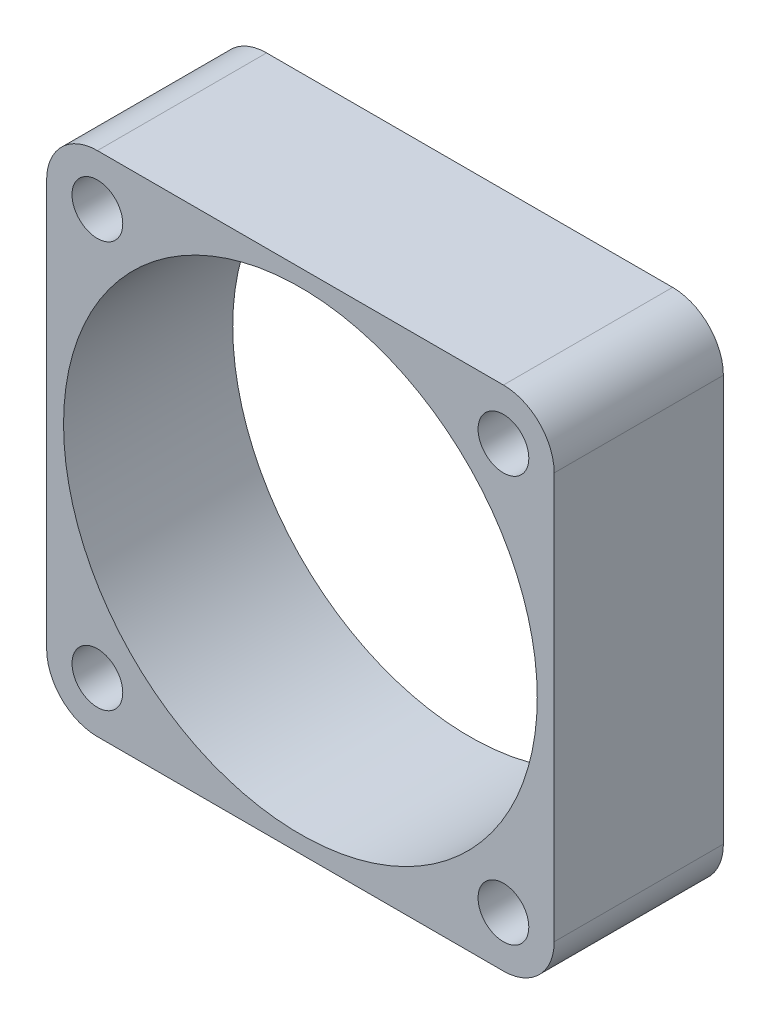
ISO-10303-21;
HEADER;
FILE_DESCRIPTION(('STEP AP214'),'2;1');
FILE_NAME('part.step','',(''),(''),'','','');
FILE_SCHEMA(('AUTOMOTIVE_DESIGN { 1 0 10303 214 1 1 1 1 }'));
ENDSEC;
DATA;
#1=APPLICATION_CONTEXT('core data for automotive mechanical design processes');
#2=APPLICATION_PROTOCOL_DEFINITION('international standard','automotive_design',2000,#1);
#3=PRODUCT_CONTEXT('',#1,'mechanical');
#4=PRODUCT('Part','Part','',(#3));
#5=PRODUCT_RELATED_PRODUCT_CATEGORY('part','',(#4));
#6=PRODUCT_DEFINITION_FORMATION('','',#4);
#7=PRODUCT_DEFINITION_CONTEXT('part definition',#1,'design');
#8=PRODUCT_DEFINITION('design','',#6,#7);
#9=PRODUCT_DEFINITION_SHAPE('','',#8);
#10=(LENGTH_UNIT() NAMED_UNIT(*) SI_UNIT(.MILLI.,.METRE.));
#11=(NAMED_UNIT(*) PLANE_ANGLE_UNIT() SI_UNIT($,.RADIAN.));
#12=(NAMED_UNIT(*) SI_UNIT($,.STERADIAN.) SOLID_ANGLE_UNIT());
#13=UNCERTAINTY_MEASURE_WITH_UNIT(LENGTH_MEASURE(1.E-05),#10,'distance_accuracy_value','');
#14=(GEOMETRIC_REPRESENTATION_CONTEXT(3) GLOBAL_UNCERTAINTY_ASSIGNED_CONTEXT((#13)) GLOBAL_UNIT_ASSIGNED_CONTEXT((#10,
#11,#12)) REPRESENTATION_CONTEXT('',''));
#15=CARTESIAN_POINT('',(0.,0.,0.));
#16=DIRECTION('',(0.,0.,1.));
#17=DIRECTION('',(1.,0.,0.));
#18=AXIS2_PLACEMENT_3D('',#15,#16,#17);
#19=CARTESIAN_POINT('',(0.,0.,10.));
#20=DIRECTION('',(0.,0.,-1.));
#21=DIRECTION('',(-1.,0.,0.));
#22=AXIS2_PLACEMENT_3D('',#19,#20,#21);
#23=PLANE('',#22);
#24=DIRECTION('',(0.,-1.,0.));
#25=VECTOR('',#24,1.);
#26=CARTESIAN_POINT('',(-15.,15.,10.));
#27=LINE('',#26,#25);
#28=CARTESIAN_POINT('',(-15.,12.,10.));
#29=VERTEX_POINT('',#28);
#30=CARTESIAN_POINT('',(-15.,-12.,10.));
#31=VERTEX_POINT('',#30);
#32=EDGE_CURVE('E143',#29,#31,#27,.T.);
#33=ORIENTED_EDGE('',*,*,#32,.T.);
#34=CARTESIAN_POINT('',(-12.,-12.,10.));
#35=DIRECTION('',(0.,0.,-1.));
#36=DIRECTION('',(-1.,0.,0.));
#37=AXIS2_PLACEMENT_3D('',#34,#35,#36);
#38=CIRCLE('',#37,3.);
#39=CARTESIAN_POINT('',(-12.,-15.,10.));
#40=VERTEX_POINT('',#39);
#41=EDGE_CURVE('E157',#31,#40,#38,.F.);
#42=ORIENTED_EDGE('',*,*,#41,.T.);
#43=DIRECTION('',(1.,0.,0.));
#44=VECTOR('',#43,1.);
#45=CARTESIAN_POINT('',(15.,-15.,10.));
#46=LINE('',#45,#44);
#47=CARTESIAN_POINT('',(12.,-15.,10.));
#48=VERTEX_POINT('',#47);
#49=EDGE_CURVE('E124',#40,#48,#46,.T.);
#50=ORIENTED_EDGE('',*,*,#49,.T.);
#51=CARTESIAN_POINT('',(12.,-12.,10.));
#52=DIRECTION('',(0.,0.,-1.));
#53=DIRECTION('',(-1.,0.,0.));
#54=AXIS2_PLACEMENT_3D('',#51,#52,#53);
#55=CIRCLE('',#54,3.);
#56=CARTESIAN_POINT('',(15.,-12.,10.));
#57=VERTEX_POINT('',#56);
#58=EDGE_CURVE('E153',#48,#57,#55,.F.);
#59=ORIENTED_EDGE('',*,*,#58,.T.);
#60=DIRECTION('',(0.,1.,0.));
#61=VECTOR('',#60,1.);
#62=CARTESIAN_POINT('',(15.,15.,10.));
#63=LINE('',#62,#61);
#64=CARTESIAN_POINT('',(15.,12.,10.));
#65=VERTEX_POINT('',#64);
#66=EDGE_CURVE('E166',#57,#65,#63,.T.);
#67=ORIENTED_EDGE('',*,*,#66,.T.);
#68=CARTESIAN_POINT('',(12.,12.,10.));
#69=DIRECTION('',(0.,0.,-1.));
#70=DIRECTION('',(-1.,0.,0.));
#71=AXIS2_PLACEMENT_3D('',#68,#69,#70);
#72=CIRCLE('',#71,3.);
#73=CARTESIAN_POINT('',(12.,15.,10.));
#74=VERTEX_POINT('',#73);
#75=EDGE_CURVE('E59',#65,#74,#72,.F.);
#76=ORIENTED_EDGE('',*,*,#75,.T.);
#77=DIRECTION('',(-1.,0.,0.));
#78=VECTOR('',#77,1.);
#79=CARTESIAN_POINT('',(15.,15.,10.));
#80=LINE('',#79,#78);
#81=CARTESIAN_POINT('',(-12.,15.,10.));
#82=VERTEX_POINT('',#81);
#83=EDGE_CURVE('E144',#74,#82,#80,.T.);
#84=ORIENTED_EDGE('',*,*,#83,.T.);
#85=CARTESIAN_POINT('',(-12.,12.,10.));
#86=DIRECTION('',(0.,0.,-1.));
#87=DIRECTION('',(-1.,0.,0.));
#88=AXIS2_PLACEMENT_3D('',#85,#86,#87);
#89=CIRCLE('',#88,3.);
#90=EDGE_CURVE('E155',#82,#29,#89,.F.);
#91=ORIENTED_EDGE('',*,*,#90,.T.);
#92=EDGE_LOOP('',(#33,#42,#50,#59,#67,#76,#84,#91));
#93=FACE_BOUND('',#92,.T.);
#94=CARTESIAN_POINT('',(0.,0.,10.));
#95=DIRECTION('',(0.,0.,1.));
#96=DIRECTION('',(1.,0.,0.));
#97=AXIS2_PLACEMENT_3D('',#94,#95,#96);
#98=CIRCLE('',#97,14.);
#99=CARTESIAN_POINT('',(14.,0.,10.));
#100=VERTEX_POINT('',#99);
#101=EDGE_CURVE('E138',#100,#100,#98,.T.);
#102=ORIENTED_EDGE('',*,*,#101,.F.);
#103=EDGE_LOOP('',(#102));
#104=FACE_BOUND('',#103,.T.);
#105=CARTESIAN_POINT('',(-12.,12.,10.));
#106=DIRECTION('',(0.,0.,1.));
#107=DIRECTION('',(1.,0.,0.));
#108=AXIS2_PLACEMENT_3D('',#105,#106,#107);
#109=CIRCLE('',#108,1.5);
#110=CARTESIAN_POINT('',(-10.5,12.,10.));
#111=VERTEX_POINT('',#110);
#112=EDGE_CURVE('E189',#111,#111,#109,.T.);
#113=ORIENTED_EDGE('',*,*,#112,.F.);
#114=EDGE_LOOP('',(#113));
#115=FACE_BOUND('',#114,.T.);
#116=CARTESIAN_POINT('',(12.,12.0000000000007,10.));
#117=DIRECTION('',(0.,0.,1.));
#118=DIRECTION('',(1.,0.,0.));
#119=AXIS2_PLACEMENT_3D('',#116,#117,#118);
#120=CIRCLE('',#119,1.5000000000007);
#121=CARTESIAN_POINT('',(13.5000000000007,12.0000000000007,10.));
#122=VERTEX_POINT('',#121);
#123=EDGE_CURVE('E195',#122,#122,#120,.T.);
#124=ORIENTED_EDGE('',*,*,#123,.F.);
#125=EDGE_LOOP('',(#124));
#126=FACE_BOUND('',#125,.T.);
#127=CARTESIAN_POINT('',(12.0000000000007,-11.9999999999993,10.));
#128=DIRECTION('',(0.,0.,1.));
#129=DIRECTION('',(1.,0.,0.));
#130=AXIS2_PLACEMENT_3D('',#127,#128,#129);
#131=CIRCLE('',#130,1.50000000000095);
#132=CARTESIAN_POINT('',(13.5000000000016,-11.9999999999993,10.));
#133=VERTEX_POINT('',#132);
#134=EDGE_CURVE('E201',#133,#133,#131,.T.);
#135=ORIENTED_EDGE('',*,*,#134,.F.);
#136=EDGE_LOOP('',(#135));
#137=FACE_BOUND('',#136,.T.);
#138=CARTESIAN_POINT('',(-11.9999999999993,-12.,10.));
#139=DIRECTION('',(0.,0.,1.));
#140=DIRECTION('',(1.,0.,0.));
#141=AXIS2_PLACEMENT_3D('',#138,#139,#140);
#142=CIRCLE('',#141,1.50000000000036);
#143=CARTESIAN_POINT('',(-10.499999999999,-12.,10.));
#144=VERTEX_POINT('',#143);
#145=EDGE_CURVE('E207',#144,#144,#142,.T.);
#146=ORIENTED_EDGE('',*,*,#145,.F.);
#147=EDGE_LOOP('',(#146));
#148=FACE_BOUND('',#147,.T.);
#149=ADVANCED_FACE('F37',(#93,#104,#115,#126,#137,#148),#23,.F.);
#150=CARTESIAN_POINT('',(0.,0.,0.));
#151=DIRECTION('',(0.,0.,-1.));
#152=DIRECTION('',(-1.,0.,0.));
#153=AXIS2_PLACEMENT_3D('',#150,#151,#152);
#154=PLANE('',#153);
#155=CARTESIAN_POINT('',(12.0000000000007,-11.9999999999993,0.));
#156=DIRECTION('',(0.,0.,1.));
#157=DIRECTION('',(1.,0.,0.));
#158=AXIS2_PLACEMENT_3D('',#155,#156,#157);
#159=CIRCLE('',#158,1.50000000000095);
#160=CARTESIAN_POINT('',(13.5000000000016,-11.9999999999993,0.));
#161=VERTEX_POINT('',#160);
#162=EDGE_CURVE('E204',#161,#161,#159,.T.);
#163=ORIENTED_EDGE('',*,*,#162,.T.);
#164=EDGE_LOOP('',(#163));
#165=FACE_BOUND('',#164,.T.);
#166=CARTESIAN_POINT('',(-12.,12.,0.));
#167=DIRECTION('',(0.,0.,1.));
#168=DIRECTION('',(1.,0.,0.));
#169=AXIS2_PLACEMENT_3D('',#166,#167,#168);
#170=CIRCLE('',#169,1.5);
#171=CARTESIAN_POINT('',(-10.5,12.,0.));
#172=VERTEX_POINT('',#171);
#173=EDGE_CURVE('E192',#172,#172,#170,.T.);
#174=ORIENTED_EDGE('',*,*,#173,.T.);
#175=EDGE_LOOP('',(#174));
#176=FACE_BOUND('',#175,.T.);
#177=DIRECTION('',(1.,0.,0.));
#178=VECTOR('',#177,1.);
#179=CARTESIAN_POINT('',(15.,-15.,0.));
#180=LINE('',#179,#178);
#181=CARTESIAN_POINT('',(-12.,-15.,0.));
#182=VERTEX_POINT('',#181);
#183=CARTESIAN_POINT('',(12.,-15.,0.));
#184=VERTEX_POINT('',#183);
#185=EDGE_CURVE('E121',#182,#184,#180,.T.);
#186=ORIENTED_EDGE('',*,*,#185,.F.);
#187=CARTESIAN_POINT('',(-12.,-12.,0.));
#188=DIRECTION('',(0.,0.,-1.));
#189=DIRECTION('',(-1.,0.,0.));
#190=AXIS2_PLACEMENT_3D('',#187,#188,#189);
#191=CIRCLE('',#190,3.);
#192=CARTESIAN_POINT('',(-15.,-12.,0.));
#193=VERTEX_POINT('',#192);
#194=EDGE_CURVE('E104',#182,#193,#191,.T.);
#195=ORIENTED_EDGE('',*,*,#194,.T.);
#196=DIRECTION('',(0.,-1.,0.));
#197=VECTOR('',#196,1.);
#198=CARTESIAN_POINT('',(-15.,15.,0.));
#199=LINE('',#198,#197);
#200=CARTESIAN_POINT('',(-15.,12.,0.));
#201=VERTEX_POINT('',#200);
#202=EDGE_CURVE('E133',#201,#193,#199,.T.);
#203=ORIENTED_EDGE('',*,*,#202,.F.);
#204=CARTESIAN_POINT('',(-12.,12.,0.));
#205=DIRECTION('',(0.,0.,-1.));
#206=DIRECTION('',(-1.,0.,0.));
#207=AXIS2_PLACEMENT_3D('',#204,#205,#206);
#208=CIRCLE('',#207,3.);
#209=CARTESIAN_POINT('',(-12.,15.,0.));
#210=VERTEX_POINT('',#209);
#211=EDGE_CURVE('E115',#201,#210,#208,.T.);
#212=ORIENTED_EDGE('',*,*,#211,.T.);
#213=DIRECTION('',(-1.,0.,0.));
#214=VECTOR('',#213,1.);
#215=CARTESIAN_POINT('',(15.,15.,0.));
#216=LINE('',#215,#214);
#217=CARTESIAN_POINT('',(12.,15.,0.));
#218=VERTEX_POINT('',#217);
#219=EDGE_CURVE('E136',#218,#210,#216,.T.);
#220=ORIENTED_EDGE('',*,*,#219,.F.);
#221=CARTESIAN_POINT('',(12.,12.,0.));
#222=DIRECTION('',(0.,0.,-1.));
#223=DIRECTION('',(-1.,0.,0.));
#224=AXIS2_PLACEMENT_3D('',#221,#222,#223);
#225=CIRCLE('',#224,3.);
#226=CARTESIAN_POINT('',(15.,12.,0.));
#227=VERTEX_POINT('',#226);
#228=EDGE_CURVE('E125',#218,#227,#225,.T.);
#229=ORIENTED_EDGE('',*,*,#228,.T.);
#230=DIRECTION('',(0.,1.,0.));
#231=VECTOR('',#230,1.);
#232=CARTESIAN_POINT('',(15.,15.,0.));
#233=LINE('',#232,#231);
#234=CARTESIAN_POINT('',(15.,-12.,0.));
#235=VERTEX_POINT('',#234);
#236=EDGE_CURVE('E132',#235,#227,#233,.T.);
#237=ORIENTED_EDGE('',*,*,#236,.F.);
#238=CARTESIAN_POINT('',(12.,-12.,0.));
#239=DIRECTION('',(0.,0.,-1.));
#240=DIRECTION('',(-1.,0.,0.));
#241=AXIS2_PLACEMENT_3D('',#238,#239,#240);
#242=CIRCLE('',#241,3.);
#243=EDGE_CURVE('E131',#235,#184,#242,.T.);
#244=ORIENTED_EDGE('',*,*,#243,.T.);
#245=EDGE_LOOP('',(#186,#195,#203,#212,#220,#229,#237,#244));
#246=FACE_BOUND('',#245,.T.);
#247=CARTESIAN_POINT('',(0.,0.,0.));
#248=DIRECTION('',(0.,0.,1.));
#249=DIRECTION('',(1.,0.,0.));
#250=AXIS2_PLACEMENT_3D('',#247,#248,#249);
#251=CIRCLE('',#250,14.);
#252=CARTESIAN_POINT('',(14.,0.,0.));
#253=VERTEX_POINT('',#252);
#254=EDGE_CURVE('E186',#253,#253,#251,.T.);
#255=ORIENTED_EDGE('',*,*,#254,.T.);
#256=EDGE_LOOP('',(#255));
#257=FACE_BOUND('',#256,.T.);
#258=CARTESIAN_POINT('',(12.,12.0000000000007,0.));
#259=DIRECTION('',(0.,0.,1.));
#260=DIRECTION('',(1.,0.,0.));
#261=AXIS2_PLACEMENT_3D('',#258,#259,#260);
#262=CIRCLE('',#261,1.5000000000007);
#263=CARTESIAN_POINT('',(13.5000000000007,12.0000000000007,0.));
#264=VERTEX_POINT('',#263);
#265=EDGE_CURVE('E198',#264,#264,#262,.T.);
#266=ORIENTED_EDGE('',*,*,#265,.T.);
#267=EDGE_LOOP('',(#266));
#268=FACE_BOUND('',#267,.T.);
#269=CARTESIAN_POINT('',(-11.9999999999993,-12.,0.));
#270=DIRECTION('',(0.,0.,1.));
#271=DIRECTION('',(1.,0.,0.));
#272=AXIS2_PLACEMENT_3D('',#269,#270,#271);
#273=CIRCLE('',#272,1.50000000000036);
#274=CARTESIAN_POINT('',(-10.499999999999,-12.,0.));
#275=VERTEX_POINT('',#274);
#276=EDGE_CURVE('E210',#275,#275,#273,.T.);
#277=ORIENTED_EDGE('',*,*,#276,.T.);
#278=EDGE_LOOP('',(#277));
#279=FACE_BOUND('',#278,.T.);
#280=ADVANCED_FACE('F128',(#165,#176,#246,#257,#268,#279),#154,.T.);
#281=CARTESIAN_POINT('',(-15.,15.,10.));
#282=DIRECTION('',(1.,0.,0.));
#283=DIRECTION('',(0.,1.,0.));
#284=AXIS2_PLACEMENT_3D('',#281,#282,#283);
#285=PLANE('',#284);
#286=ORIENTED_EDGE('',*,*,#202,.T.);
#287=DIRECTION('',(0.,0.,-1.));
#288=VECTOR('',#287,1.);
#289=CARTESIAN_POINT('',(-15.,-12.,10.));
#290=LINE('',#289,#288);
#291=EDGE_CURVE('E109',#193,#31,#290,.F.);
#292=ORIENTED_EDGE('',*,*,#291,.T.);
#293=ORIENTED_EDGE('',*,*,#32,.F.);
#294=DIRECTION('',(0.,0.,-1.));
#295=VECTOR('',#294,1.);
#296=CARTESIAN_POINT('',(-15.,12.,10.));
#297=LINE('',#296,#295);
#298=EDGE_CURVE('E114',#29,#201,#297,.T.);
#299=ORIENTED_EDGE('',*,*,#298,.T.);
#300=EDGE_LOOP('',(#286,#292,#293,#299));
#301=FACE_BOUND('',#300,.T.);
#302=ADVANCED_FACE('F182',(#301),#285,.F.);
#303=CARTESIAN_POINT('',(15.,-15.,10.));
#304=DIRECTION('',(0.,1.,0.));
#305=DIRECTION('',(-1.,0.,0.));
#306=AXIS2_PLACEMENT_3D('',#303,#304,#305);
#307=PLANE('',#306);
#308=ORIENTED_EDGE('',*,*,#49,.F.);
#309=DIRECTION('',(0.,0.,-1.));
#310=VECTOR('',#309,1.);
#311=CARTESIAN_POINT('',(-12.,-15.,10.));
#312=LINE('',#311,#310);
#313=EDGE_CURVE('E108',#40,#182,#312,.T.);
#314=ORIENTED_EDGE('',*,*,#313,.T.);
#315=ORIENTED_EDGE('',*,*,#185,.T.);
#316=DIRECTION('',(0.,0.,-1.));
#317=VECTOR('',#316,1.);
#318=CARTESIAN_POINT('',(12.,-15.,10.));
#319=LINE('',#318,#317);
#320=EDGE_CURVE('E126',#184,#48,#319,.F.);
#321=ORIENTED_EDGE('',*,*,#320,.T.);
#322=EDGE_LOOP('',(#308,#314,#315,#321));
#323=FACE_BOUND('',#322,.T.);
#324=ADVANCED_FACE('F120',(#323),#307,.F.);
#325=CARTESIAN_POINT('',(15.,15.,10.));
#326=DIRECTION('',(-1.,0.,0.));
#327=DIRECTION('',(0.,-1.,0.));
#328=AXIS2_PLACEMENT_3D('',#325,#326,#327);
#329=PLANE('',#328);
#330=ORIENTED_EDGE('',*,*,#66,.F.);
#331=DIRECTION('',(0.,0.,-1.));
#332=VECTOR('',#331,1.);
#333=CARTESIAN_POINT('',(15.,-12.,10.));
#334=LINE('',#333,#332);
#335=EDGE_CURVE('E11',#57,#235,#334,.T.);
#336=ORIENTED_EDGE('',*,*,#335,.T.);
#337=ORIENTED_EDGE('',*,*,#236,.T.);
#338=DIRECTION('',(0.,0.,-1.));
#339=VECTOR('',#338,1.);
#340=CARTESIAN_POINT('',(15.,12.,10.));
#341=LINE('',#340,#339);
#342=EDGE_CURVE('E45',#227,#65,#341,.F.);
#343=ORIENTED_EDGE('',*,*,#342,.T.);
#344=EDGE_LOOP('',(#330,#336,#337,#343));
#345=FACE_BOUND('',#344,.T.);
#346=ADVANCED_FACE('F165',(#345),#329,.F.);
#347=CARTESIAN_POINT('',(15.,15.,10.));
#348=DIRECTION('',(0.,-1.,0.));
#349=DIRECTION('',(1.,0.,0.));
#350=AXIS2_PLACEMENT_3D('',#347,#348,#349);
#351=PLANE('',#350);
#352=ORIENTED_EDGE('',*,*,#219,.T.);
#353=DIRECTION('',(0.,0.,-1.));
#354=VECTOR('',#353,1.);
#355=CARTESIAN_POINT('',(-12.,15.,10.));
#356=LINE('',#355,#354);
#357=EDGE_CURVE('E52',#210,#82,#356,.F.);
#358=ORIENTED_EDGE('',*,*,#357,.T.);
#359=ORIENTED_EDGE('',*,*,#83,.F.);
#360=DIRECTION('',(0.,0.,-1.));
#361=VECTOR('',#360,1.);
#362=CARTESIAN_POINT('',(12.,15.,10.));
#363=LINE('',#362,#361);
#364=EDGE_CURVE('E159',#74,#218,#363,.T.);
#365=ORIENTED_EDGE('',*,*,#364,.T.);
#366=EDGE_LOOP('',(#352,#358,#359,#365));
#367=FACE_BOUND('',#366,.T.);
#368=ADVANCED_FACE('F175',(#367),#351,.F.);
#369=CARTESIAN_POINT('',(0.,0.,10.));
#370=DIRECTION('',(0.,0.,-1.));
#371=DIRECTION('',(-1.,0.,0.));
#372=AXIS2_PLACEMENT_3D('',#369,#370,#371);
#373=CYLINDRICAL_SURFACE('',#372,14.);
#374=ORIENTED_EDGE('',*,*,#101,.T.);
#375=EDGE_LOOP('',(#374));
#376=FACE_BOUND('',#375,.T.);
#377=ORIENTED_EDGE('',*,*,#254,.F.);
#378=EDGE_LOOP('',(#377));
#379=FACE_BOUND('',#378,.T.);
#380=ADVANCED_FACE('F227',(#376,#379),#373,.F.);
#381=CARTESIAN_POINT('',(-12.,12.,10.));
#382=DIRECTION('',(0.,0.,-1.));
#383=DIRECTION('',(-1.,0.,0.));
#384=AXIS2_PLACEMENT_3D('',#381,#382,#383);
#385=CYLINDRICAL_SURFACE('',#384,1.5);
#386=ORIENTED_EDGE('',*,*,#112,.T.);
#387=EDGE_LOOP('',(#386));
#388=FACE_BOUND('',#387,.T.);
#389=ORIENTED_EDGE('',*,*,#173,.F.);
#390=EDGE_LOOP('',(#389));
#391=FACE_BOUND('',#390,.T.);
#392=ADVANCED_FACE('F329',(#388,#391),#385,.F.);
#393=CARTESIAN_POINT('',(12.,12.0000000000007,10.));
#394=DIRECTION('',(0.,0.,-1.));
#395=DIRECTION('',(-1.,0.,0.));
#396=AXIS2_PLACEMENT_3D('',#393,#394,#395);
#397=CYLINDRICAL_SURFACE('',#396,1.5000000000007);
#398=ORIENTED_EDGE('',*,*,#123,.T.);
#399=EDGE_LOOP('',(#398));
#400=FACE_BOUND('',#399,.T.);
#401=ORIENTED_EDGE('',*,*,#265,.F.);
#402=EDGE_LOOP('',(#401));
#403=FACE_BOUND('',#402,.T.);
#404=ADVANCED_FACE('F319',(#400,#403),#397,.F.);
#405=CARTESIAN_POINT('',(12.0000000000007,-11.9999999999993,10.));
#406=DIRECTION('',(0.,0.,-1.));
#407=DIRECTION('',(-1.,0.,0.));
#408=AXIS2_PLACEMENT_3D('',#405,#406,#407);
#409=CYLINDRICAL_SURFACE('',#408,1.50000000000095);
#410=ORIENTED_EDGE('',*,*,#134,.T.);
#411=EDGE_LOOP('',(#410));
#412=FACE_BOUND('',#411,.T.);
#413=ORIENTED_EDGE('',*,*,#162,.F.);
#414=EDGE_LOOP('',(#413));
#415=FACE_BOUND('',#414,.T.);
#416=ADVANCED_FACE('F310',(#412,#415),#409,.F.);
#417=CARTESIAN_POINT('',(-11.9999999999993,-12.,10.));
#418=DIRECTION('',(0.,0.,-1.));
#419=DIRECTION('',(-1.,0.,0.));
#420=AXIS2_PLACEMENT_3D('',#417,#418,#419);
#421=CYLINDRICAL_SURFACE('',#420,1.50000000000036);
#422=ORIENTED_EDGE('',*,*,#145,.T.);
#423=EDGE_LOOP('',(#422));
#424=FACE_BOUND('',#423,.T.);
#425=ORIENTED_EDGE('',*,*,#276,.F.);
#426=EDGE_LOOP('',(#425));
#427=FACE_BOUND('',#426,.T.);
#428=ADVANCED_FACE('F216',(#424,#427),#421,.F.);
#429=CARTESIAN_POINT('',(-12.,-12.,10.));
#430=DIRECTION('',(0.,0.,-1.));
#431=DIRECTION('',(-1.,0.,0.));
#432=AXIS2_PLACEMENT_3D('',#429,#430,#431);
#433=CYLINDRICAL_SURFACE('',#432,3.);
#434=ORIENTED_EDGE('',*,*,#41,.F.);
#435=ORIENTED_EDGE('',*,*,#291,.F.);
#436=ORIENTED_EDGE('',*,*,#194,.F.);
#437=ORIENTED_EDGE('',*,*,#313,.F.);
#438=EDGE_LOOP('',(#434,#435,#436,#437));
#439=FACE_BOUND('',#438,.T.);
#440=ADVANCED_FACE('F107',(#439),#433,.T.);
#441=CARTESIAN_POINT('',(-12.,12.,10.));
#442=DIRECTION('',(0.,0.,-1.));
#443=DIRECTION('',(-1.,0.,0.));
#444=AXIS2_PLACEMENT_3D('',#441,#442,#443);
#445=CYLINDRICAL_SURFACE('',#444,3.);
#446=ORIENTED_EDGE('',*,*,#90,.F.);
#447=ORIENTED_EDGE('',*,*,#357,.F.);
#448=ORIENTED_EDGE('',*,*,#211,.F.);
#449=ORIENTED_EDGE('',*,*,#298,.F.);
#450=EDGE_LOOP('',(#446,#447,#448,#449));
#451=FACE_BOUND('',#450,.T.);
#452=ADVANCED_FACE('F179',(#451),#445,.T.);
#453=CARTESIAN_POINT('',(12.,-12.,10.));
#454=DIRECTION('',(0.,0.,-1.));
#455=DIRECTION('',(-1.,0.,0.));
#456=AXIS2_PLACEMENT_3D('',#453,#454,#455);
#457=CYLINDRICAL_SURFACE('',#456,3.);
#458=ORIENTED_EDGE('',*,*,#58,.F.);
#459=ORIENTED_EDGE('',*,*,#320,.F.);
#460=ORIENTED_EDGE('',*,*,#243,.F.);
#461=ORIENTED_EDGE('',*,*,#335,.F.);
#462=EDGE_LOOP('',(#458,#459,#460,#461));
#463=FACE_BOUND('',#462,.T.);
#464=ADVANCED_FACE('F241',(#463),#457,.T.);
#465=CARTESIAN_POINT('',(12.,12.,10.));
#466=DIRECTION('',(0.,0.,-1.));
#467=DIRECTION('',(-1.,0.,0.));
#468=AXIS2_PLACEMENT_3D('',#465,#466,#467);
#469=CYLINDRICAL_SURFACE('',#468,3.);
#470=ORIENTED_EDGE('',*,*,#75,.F.);
#471=ORIENTED_EDGE('',*,*,#342,.F.);
#472=ORIENTED_EDGE('',*,*,#228,.F.);
#473=ORIENTED_EDGE('',*,*,#364,.F.);
#474=EDGE_LOOP('',(#470,#471,#472,#473));
#475=FACE_BOUND('',#474,.T.);
#476=ADVANCED_FACE('F39',(#475),#469,.T.);
#477=CLOSED_SHELL('',(#149,#280,#302,#324,#346,#368,#380,#392,#404,#416,#428,#440,#452,#464,#476));
#478=MANIFOLD_SOLID_BREP('B2',#477);
#479=ADVANCED_BREP_SHAPE_REPRESENTATION('',(#18,#478),#14);
#480=SHAPE_DEFINITION_REPRESENTATION(#9,#479);
ENDSEC;
END-ISO-10303-21;
